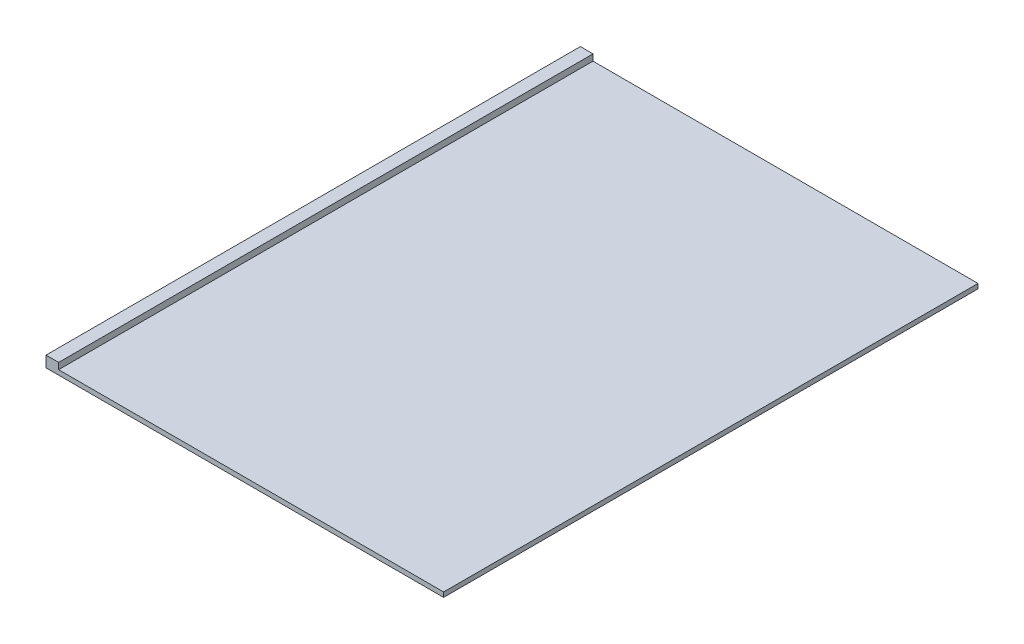
ISO-10303-21;
HEADER;
FILE_DESCRIPTION(('STEP AP214'),'2;1');
FILE_NAME('part.step','',(''),(''),'','','');
FILE_SCHEMA(('AUTOMOTIVE_DESIGN { 1 0 10303 214 1 1 1 1 }'));
ENDSEC;
DATA;
#1=APPLICATION_CONTEXT('core data for automotive mechanical design processes');
#2=APPLICATION_PROTOCOL_DEFINITION('international standard','automotive_design',2000,#1);
#3=PRODUCT_CONTEXT('',#1,'mechanical');
#4=PRODUCT('Part','Part','',(#3));
#5=PRODUCT_RELATED_PRODUCT_CATEGORY('part','',(#4));
#6=PRODUCT_DEFINITION_FORMATION('','',#4);
#7=PRODUCT_DEFINITION_CONTEXT('part definition',#1,'design');
#8=PRODUCT_DEFINITION('design','',#6,#7);
#9=PRODUCT_DEFINITION_SHAPE('','',#8);
#10=(LENGTH_UNIT() NAMED_UNIT(*) SI_UNIT(.MILLI.,.METRE.));
#11=(NAMED_UNIT(*) PLANE_ANGLE_UNIT() SI_UNIT($,.RADIAN.));
#12=(NAMED_UNIT(*) SI_UNIT($,.STERADIAN.) SOLID_ANGLE_UNIT());
#13=UNCERTAINTY_MEASURE_WITH_UNIT(LENGTH_MEASURE(1.E-05),#10,'distance_accuracy_value','');
#14=(GEOMETRIC_REPRESENTATION_CONTEXT(3) GLOBAL_UNCERTAINTY_ASSIGNED_CONTEXT((#13)) GLOBAL_UNIT_ASSIGNED_CONTEXT((#10,
#11,#12)) REPRESENTATION_CONTEXT('',''));
#15=CARTESIAN_POINT('',(0.,0.,0.));
#16=DIRECTION('',(0.,0.,1.));
#17=DIRECTION('',(1.,0.,0.));
#18=AXIS2_PLACEMENT_3D('',#15,#16,#17);
#19=CARTESIAN_POINT('',(0.,1.125,0.));
#20=DIRECTION('',(0.,-1.,0.));
#21=DIRECTION('',(0.,0.,-1.));
#22=AXIS2_PLACEMENT_3D('',#19,#20,#21);
#23=PLANE('',#22);
#24=DIRECTION('',(0.,0.,-1.));
#25=VECTOR('',#24,1.);
#26=CARTESIAN_POINT('',(3.,1.125,-127.));
#27=LINE('',#26,#25);
#28=CARTESIAN_POINT('',(3.00000000000001,1.125,0.));
#29=VERTEX_POINT('',#28);
#30=CARTESIAN_POINT('',(3.,1.125,-127.));
#31=VERTEX_POINT('',#30);
#32=EDGE_CURVE('E48',#29,#31,#27,.T.);
#33=ORIENTED_EDGE('',*,*,#32,.F.);
#34=DIRECTION('',(1.,0.,0.));
#35=VECTOR('',#34,1.);
#36=CARTESIAN_POINT('',(0.,1.125,0.));
#37=LINE('',#36,#35);
#38=CARTESIAN_POINT('',(94.5,1.125,0.));
#39=VERTEX_POINT('',#38);
#40=EDGE_CURVE('E85',#29,#39,#37,.T.);
#41=ORIENTED_EDGE('',*,*,#40,.T.);
#42=DIRECTION('',(0.,0.,-1.));
#43=VECTOR('',#42,1.);
#44=CARTESIAN_POINT('',(94.5,1.125,0.));
#45=LINE('',#44,#43);
#46=CARTESIAN_POINT('',(94.5,1.125,-127.));
#47=VERTEX_POINT('',#46);
#48=EDGE_CURVE('E54',#39,#47,#45,.T.);
#49=ORIENTED_EDGE('',*,*,#48,.T.);
#50=DIRECTION('',(-1.,0.,0.));
#51=VECTOR('',#50,1.);
#52=CARTESIAN_POINT('',(0.,1.125,-127.));
#53=LINE('',#52,#51);
#54=EDGE_CURVE('E95',#47,#31,#53,.T.);
#55=ORIENTED_EDGE('',*,*,#54,.T.);
#56=EDGE_LOOP('',(#33,#41,#49,#55));
#57=FACE_BOUND('',#56,.T.);
#58=ADVANCED_FACE('F33',(#57),#23,.F.);
#59=CARTESIAN_POINT('',(0.,1.125,0.));
#60=DIRECTION('',(1.,0.,0.));
#61=DIRECTION('',(0.,0.,-1.));
#62=AXIS2_PLACEMENT_3D('',#59,#60,#61);
#63=PLANE('',#62);
#64=DIRECTION('',(0.,0.,1.));
#65=VECTOR('',#64,1.);
#66=CARTESIAN_POINT('',(0.,0.,0.));
#67=LINE('',#66,#65);
#68=CARTESIAN_POINT('',(0.,0.,-127.));
#69=VERTEX_POINT('',#68);
#70=CARTESIAN_POINT('',(0.,0.,0.));
#71=VERTEX_POINT('',#70);
#72=EDGE_CURVE('E92',#69,#71,#67,.T.);
#73=ORIENTED_EDGE('',*,*,#72,.T.);
#74=DIRECTION('',(0.,-1.,0.));
#75=VECTOR('',#74,1.);
#76=CARTESIAN_POINT('',(0.,1.125,0.));
#77=LINE('',#76,#75);
#78=CARTESIAN_POINT('',(0.,2.625,0.));
#79=VERTEX_POINT('',#78);
#80=EDGE_CURVE('E11',#79,#71,#77,.T.);
#81=ORIENTED_EDGE('',*,*,#80,.F.);
#82=DIRECTION('',(0.,0.,1.));
#83=VECTOR('',#82,1.);
#84=CARTESIAN_POINT('',(0.,2.625,-127.));
#85=LINE('',#84,#83);
#86=CARTESIAN_POINT('',(0.,2.625,-127.));
#87=VERTEX_POINT('',#86);
#88=EDGE_CURVE('E94',#87,#79,#85,.T.);
#89=ORIENTED_EDGE('',*,*,#88,.F.);
#90=DIRECTION('',(0.,-1.,0.));
#91=VECTOR('',#90,1.);
#92=CARTESIAN_POINT('',(0.,1.125,-127.));
#93=LINE('',#92,#91);
#94=EDGE_CURVE('E78',#87,#69,#93,.T.);
#95=ORIENTED_EDGE('',*,*,#94,.T.);
#96=EDGE_LOOP('',(#73,#81,#89,#95));
#97=FACE_BOUND('',#96,.T.);
#98=ADVANCED_FACE('F35',(#97),#63,.F.);
#99=CARTESIAN_POINT('',(0.,1.125,0.));
#100=DIRECTION('',(0.,0.,-1.));
#101=DIRECTION('',(-1.,0.,0.));
#102=AXIS2_PLACEMENT_3D('',#99,#100,#101);
#103=PLANE('',#102);
#104=DIRECTION('',(1.,0.,0.));
#105=VECTOR('',#104,1.);
#106=CARTESIAN_POINT('',(0.,0.,0.));
#107=LINE('',#106,#105);
#108=CARTESIAN_POINT('',(94.5,0.,0.));
#109=VERTEX_POINT('',#108);
#110=EDGE_CURVE('E98',#71,#109,#107,.T.);
#111=ORIENTED_EDGE('',*,*,#110,.T.);
#112=DIRECTION('',(0.,-1.,0.));
#113=VECTOR('',#112,1.);
#114=CARTESIAN_POINT('',(94.5,1.125,0.));
#115=LINE('',#114,#113);
#116=EDGE_CURVE('E41',#39,#109,#115,.T.);
#117=ORIENTED_EDGE('',*,*,#116,.F.);
#118=ORIENTED_EDGE('',*,*,#40,.F.);
#119=DIRECTION('',(0.,-1.,0.));
#120=VECTOR('',#119,1.);
#121=CARTESIAN_POINT('',(3.00000000000002,2.625,0.));
#122=LINE('',#121,#120);
#123=CARTESIAN_POINT('',(3.00000000000002,2.625,0.));
#124=VERTEX_POINT('',#123);
#125=EDGE_CURVE('E99',#124,#29,#122,.T.);
#126=ORIENTED_EDGE('',*,*,#125,.F.);
#127=DIRECTION('',(1.,0.,0.));
#128=VECTOR('',#127,1.);
#129=CARTESIAN_POINT('',(0.,2.625,0.));
#130=LINE('',#129,#128);
#131=EDGE_CURVE('E119',#79,#124,#130,.T.);
#132=ORIENTED_EDGE('',*,*,#131,.F.);
#133=ORIENTED_EDGE('',*,*,#80,.T.);
#134=EDGE_LOOP('',(#111,#117,#118,#126,#132,#133));
#135=FACE_BOUND('',#134,.T.);
#136=ADVANCED_FACE('F114',(#135),#103,.F.);
#137=CARTESIAN_POINT('',(94.5,1.125,0.));
#138=DIRECTION('',(-1.,0.,0.));
#139=DIRECTION('',(0.,0.,1.));
#140=AXIS2_PLACEMENT_3D('',#137,#138,#139);
#141=PLANE('',#140);
#142=DIRECTION('',(0.,0.,-1.));
#143=VECTOR('',#142,1.);
#144=CARTESIAN_POINT('',(94.5,0.,0.));
#145=LINE('',#144,#143);
#146=CARTESIAN_POINT('',(94.5,0.,-127.));
#147=VERTEX_POINT('',#146);
#148=EDGE_CURVE('E86',#109,#147,#145,.T.);
#149=ORIENTED_EDGE('',*,*,#148,.T.);
#150=DIRECTION('',(0.,-1.,0.));
#151=VECTOR('',#150,1.);
#152=CARTESIAN_POINT('',(94.5,1.125,-127.));
#153=LINE('',#152,#151);
#154=EDGE_CURVE('E81',#47,#147,#153,.T.);
#155=ORIENTED_EDGE('',*,*,#154,.F.);
#156=ORIENTED_EDGE('',*,*,#48,.F.);
#157=ORIENTED_EDGE('',*,*,#116,.T.);
#158=EDGE_LOOP('',(#149,#155,#156,#157));
#159=FACE_BOUND('',#158,.T.);
#160=ADVANCED_FACE('F112',(#159),#141,.F.);
#161=CARTESIAN_POINT('',(0.,1.125,-127.));
#162=DIRECTION('',(0.,0.,1.));
#163=DIRECTION('',(1.,0.,0.));
#164=AXIS2_PLACEMENT_3D('',#161,#162,#163);
#165=PLANE('',#164);
#166=DIRECTION('',(-1.,0.,0.));
#167=VECTOR('',#166,1.);
#168=CARTESIAN_POINT('',(0.,0.,-127.));
#169=LINE('',#168,#167);
#170=EDGE_CURVE('E74',#147,#69,#169,.T.);
#171=ORIENTED_EDGE('',*,*,#170,.T.);
#172=ORIENTED_EDGE('',*,*,#94,.F.);
#173=DIRECTION('',(-1.,0.,0.));
#174=VECTOR('',#173,1.);
#175=CARTESIAN_POINT('',(0.,2.625,-127.));
#176=LINE('',#175,#174);
#177=CARTESIAN_POINT('',(3.,2.625,-127.));
#178=VERTEX_POINT('',#177);
#179=EDGE_CURVE('E133',#178,#87,#176,.T.);
#180=ORIENTED_EDGE('',*,*,#179,.F.);
#181=DIRECTION('',(0.,-1.,0.));
#182=VECTOR('',#181,1.);
#183=CARTESIAN_POINT('',(3.,2.625,-127.));
#184=LINE('',#183,#182);
#185=EDGE_CURVE('E103',#178,#31,#184,.T.);
#186=ORIENTED_EDGE('',*,*,#185,.T.);
#187=ORIENTED_EDGE('',*,*,#54,.F.);
#188=ORIENTED_EDGE('',*,*,#154,.T.);
#189=EDGE_LOOP('',(#171,#172,#180,#186,#187,#188));
#190=FACE_BOUND('',#189,.T.);
#191=ADVANCED_FACE('F76',(#190),#165,.F.);
#192=CARTESIAN_POINT('',(0.,0.,0.));
#193=DIRECTION('',(0.,-1.,0.));
#194=DIRECTION('',(0.,0.,-1.));
#195=AXIS2_PLACEMENT_3D('',#192,#193,#194);
#196=PLANE('',#195);
#197=ORIENTED_EDGE('',*,*,#72,.F.);
#198=ORIENTED_EDGE('',*,*,#170,.F.);
#199=ORIENTED_EDGE('',*,*,#148,.F.);
#200=ORIENTED_EDGE('',*,*,#110,.F.);
#201=EDGE_LOOP('',(#197,#198,#199,#200));
#202=FACE_BOUND('',#201,.T.);
#203=ADVANCED_FACE('F97',(#202),#196,.T.);
#204=CARTESIAN_POINT('',(3.,2.625,-127.));
#205=DIRECTION('',(-1.,0.,0.));
#206=DIRECTION('',(0.,0.,1.));
#207=AXIS2_PLACEMENT_3D('',#204,#205,#206);
#208=PLANE('',#207);
#209=ORIENTED_EDGE('',*,*,#32,.T.);
#210=ORIENTED_EDGE('',*,*,#185,.F.);
#211=DIRECTION('',(0.,0.,-1.));
#212=VECTOR('',#211,1.);
#213=CARTESIAN_POINT('',(3.,2.625,-127.));
#214=LINE('',#213,#212);
#215=EDGE_CURVE('E130',#124,#178,#214,.T.);
#216=ORIENTED_EDGE('',*,*,#215,.F.);
#217=ORIENTED_EDGE('',*,*,#125,.T.);
#218=EDGE_LOOP('',(#209,#210,#216,#217));
#219=FACE_BOUND('',#218,.T.);
#220=ADVANCED_FACE('F137',(#219),#208,.F.);
#221=CARTESIAN_POINT('',(0.,2.625,0.));
#222=DIRECTION('',(0.,1.,0.));
#223=DIRECTION('',(0.,0.,1.));
#224=AXIS2_PLACEMENT_3D('',#221,#222,#223);
#225=PLANE('',#224);
#226=ORIENTED_EDGE('',*,*,#88,.T.);
#227=ORIENTED_EDGE('',*,*,#131,.T.);
#228=ORIENTED_EDGE('',*,*,#215,.T.);
#229=ORIENTED_EDGE('',*,*,#179,.T.);
#230=EDGE_LOOP('',(#226,#227,#228,#229));
#231=FACE_BOUND('',#230,.T.);
#232=ADVANCED_FACE('F132',(#231),#225,.T.);
#233=CLOSED_SHELL('',(#58,#98,#136,#160,#191,#203,#220,#232));
#234=MANIFOLD_SOLID_BREP('B2',#233);
#235=ADVANCED_BREP_SHAPE_REPRESENTATION('',(#18,#234),#14);
#236=SHAPE_DEFINITION_REPRESENTATION(#9,#235);
ENDSEC;
END-ISO-10303-21;
